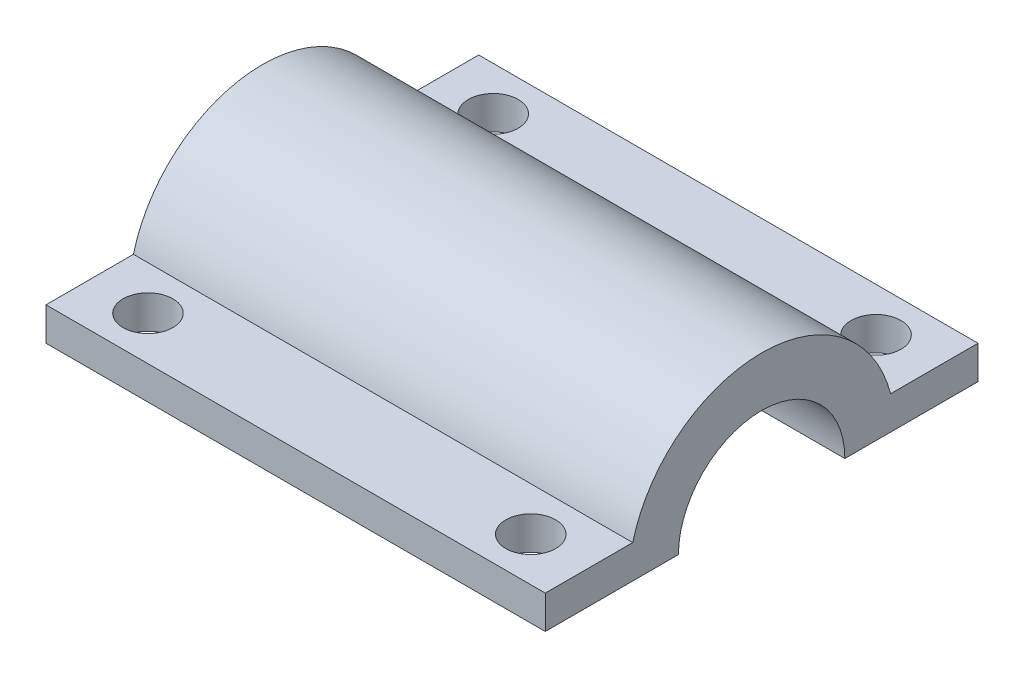
ISO-10303-21;
HEADER;
FILE_DESCRIPTION(('STEP AP214'),'2;1');
FILE_NAME('part.step','',(''),(''),'','','');
FILE_SCHEMA(('AUTOMOTIVE_DESIGN { 1 0 10303 214 1 1 1 1 }'));
ENDSEC;
DATA;
#1=APPLICATION_CONTEXT('core data for automotive mechanical design processes');
#2=APPLICATION_PROTOCOL_DEFINITION('international standard','automotive_design',2000,#1);
#3=PRODUCT_CONTEXT('',#1,'mechanical');
#4=PRODUCT('Part','Part','',(#3));
#5=PRODUCT_RELATED_PRODUCT_CATEGORY('part','',(#4));
#6=PRODUCT_DEFINITION_FORMATION('','',#4);
#7=PRODUCT_DEFINITION_CONTEXT('part definition',#1,'design');
#8=PRODUCT_DEFINITION('design','',#6,#7);
#9=PRODUCT_DEFINITION_SHAPE('','',#8);
#10=(LENGTH_UNIT() NAMED_UNIT(*) SI_UNIT(.MILLI.,.METRE.));
#11=(NAMED_UNIT(*) PLANE_ANGLE_UNIT() SI_UNIT($,.RADIAN.));
#12=(NAMED_UNIT(*) SI_UNIT($,.STERADIAN.) SOLID_ANGLE_UNIT());
#13=UNCERTAINTY_MEASURE_WITH_UNIT(LENGTH_MEASURE(1.E-05),#10,'distance_accuracy_value','');
#14=(GEOMETRIC_REPRESENTATION_CONTEXT(3) GLOBAL_UNCERTAINTY_ASSIGNED_CONTEXT((#13)) GLOBAL_UNIT_ASSIGNED_CONTEXT((#10,
#11,#12)) REPRESENTATION_CONTEXT('',''));
#15=CARTESIAN_POINT('',(0.,0.,0.));
#16=DIRECTION('',(0.,0.,1.));
#17=DIRECTION('',(1.,0.,0.));
#18=AXIS2_PLACEMENT_3D('',#15,#16,#17);
#19=CARTESIAN_POINT('',(30.,0.,0.));
#20=DIRECTION('',(-1.,0.,0.));
#21=DIRECTION('',(0.,0.,1.));
#22=AXIS2_PLACEMENT_3D('',#19,#20,#21);
#23=CYLINDRICAL_SURFACE('',#22,5.);
#24=CARTESIAN_POINT('',(0.,0.,0.));
#25=DIRECTION('',(-1.,0.,0.));
#26=DIRECTION('',(0.,0.,-1.));
#27=AXIS2_PLACEMENT_3D('',#24,#25,#26);
#28=CIRCLE('',#27,5.);
#29=CARTESIAN_POINT('',(0.,0.,5.));
#30=VERTEX_POINT('',#29);
#31=CARTESIAN_POINT('',(0.,0.,-5.));
#32=VERTEX_POINT('',#31);
#33=EDGE_CURVE('E135',#30,#32,#28,.T.);
#34=ORIENTED_EDGE('',*,*,#33,.T.);
#35=DIRECTION('',(-1.,0.,0.));
#36=VECTOR('',#35,1.);
#37=CARTESIAN_POINT('',(30.,0.,-5.));
#38=LINE('',#37,#36);
#39=CARTESIAN_POINT('',(30.,0.,-5.));
#40=VERTEX_POINT('',#39);
#41=EDGE_CURVE('E11',#40,#32,#38,.T.);
#42=ORIENTED_EDGE('',*,*,#41,.F.);
#43=CARTESIAN_POINT('',(30.,0.,0.));
#44=DIRECTION('',(-1.,0.,0.));
#45=DIRECTION('',(0.,0.,-1.));
#46=AXIS2_PLACEMENT_3D('',#43,#44,#45);
#47=CIRCLE('',#46,5.);
#48=CARTESIAN_POINT('',(30.,0.,5.));
#49=VERTEX_POINT('',#48);
#50=EDGE_CURVE('E150',#49,#40,#47,.T.);
#51=ORIENTED_EDGE('',*,*,#50,.F.);
#52=DIRECTION('',(-1.,0.,0.));
#53=VECTOR('',#52,1.);
#54=CARTESIAN_POINT('',(30.,0.,5.));
#55=LINE('',#54,#53);
#56=EDGE_CURVE('E131',#49,#30,#55,.T.);
#57=ORIENTED_EDGE('',*,*,#56,.T.);
#58=EDGE_LOOP('',(#34,#42,#51,#57));
#59=FACE_BOUND('',#58,.T.);
#60=ADVANCED_FACE('F37',(#59),#23,.F.);
#61=CARTESIAN_POINT('',(30.,0.,-5.));
#62=DIRECTION('',(0.,1.,0.));
#63=DIRECTION('',(0.,0.,1.));
#64=AXIS2_PLACEMENT_3D('',#61,#62,#63);
#65=PLANE('',#64);
#66=CARTESIAN_POINT('',(3.50000000000003,0.,-10.3729833462074));
#67=DIRECTION('',(0.,-1.,0.));
#68=DIRECTION('',(0.,0.,-1.));
#69=AXIS2_PLACEMENT_3D('',#66,#67,#68);
#70=CIRCLE('',#69,1.5);
#71=CARTESIAN_POINT('',(3.50000000000003,0.,-11.8729833462074));
#72=VERTEX_POINT('',#71);
#73=EDGE_CURVE('E242',#72,#72,#70,.T.);
#74=ORIENTED_EDGE('',*,*,#73,.F.);
#75=EDGE_LOOP('',(#74));
#76=FACE_BOUND('',#75,.T.);
#77=CARTESIAN_POINT('',(26.5,0.,-10.3729833462074));
#78=DIRECTION('',(0.,-1.,0.));
#79=DIRECTION('',(0.,0.,-1.));
#80=AXIS2_PLACEMENT_3D('',#77,#78,#79);
#81=CIRCLE('',#80,1.5);
#82=CARTESIAN_POINT('',(26.5,0.,-11.8729833462074));
#83=VERTEX_POINT('',#82);
#84=EDGE_CURVE('E162',#83,#83,#81,.T.);
#85=ORIENTED_EDGE('',*,*,#84,.F.);
#86=EDGE_LOOP('',(#85));
#87=FACE_BOUND('',#86,.T.);
#88=DIRECTION('',(0.,0.,-1.));
#89=VECTOR('',#88,1.);
#90=CARTESIAN_POINT('',(0.,0.,-5.));
#91=LINE('',#90,#89);
#92=CARTESIAN_POINT('',(0.,0.,-13.));
#93=VERTEX_POINT('',#92);
#94=EDGE_CURVE('E138',#32,#93,#91,.T.);
#95=ORIENTED_EDGE('',*,*,#94,.T.);
#96=DIRECTION('',(-1.,0.,0.));
#97=VECTOR('',#96,1.);
#98=CARTESIAN_POINT('',(30.,0.,-13.));
#99=LINE('',#98,#97);
#100=CARTESIAN_POINT('',(30.,0.,-13.));
#101=VERTEX_POINT('',#100);
#102=EDGE_CURVE('E46',#101,#93,#99,.T.);
#103=ORIENTED_EDGE('',*,*,#102,.F.);
#104=DIRECTION('',(0.,0.,-1.));
#105=VECTOR('',#104,1.);
#106=CARTESIAN_POINT('',(30.,0.,-5.));
#107=LINE('',#106,#105);
#108=EDGE_CURVE('E98',#40,#101,#107,.T.);
#109=ORIENTED_EDGE('',*,*,#108,.F.);
#110=ORIENTED_EDGE('',*,*,#41,.T.);
#111=EDGE_LOOP('',(#95,#103,#109,#110));
#112=FACE_BOUND('',#111,.T.);
#113=ADVANCED_FACE('F212',(#76,#87,#112),#65,.F.);
#114=CARTESIAN_POINT('',(30.,0.,-13.));
#115=DIRECTION('',(0.,0.,1.));
#116=DIRECTION('',(1.,0.,0.));
#117=AXIS2_PLACEMENT_3D('',#114,#115,#116);
#118=PLANE('',#117);
#119=DIRECTION('',(0.,1.,0.));
#120=VECTOR('',#119,1.);
#121=CARTESIAN_POINT('',(0.,0.,-13.));
#122=LINE('',#121,#120);
#123=CARTESIAN_POINT('',(0.,2.,-13.));
#124=VERTEX_POINT('',#123);
#125=EDGE_CURVE('E141',#93,#124,#122,.T.);
#126=ORIENTED_EDGE('',*,*,#125,.T.);
#127=DIRECTION('',(-1.,0.,0.));
#128=VECTOR('',#127,1.);
#129=CARTESIAN_POINT('',(30.,2.,-13.));
#130=LINE('',#129,#128);
#131=CARTESIAN_POINT('',(30.,2.,-13.));
#132=VERTEX_POINT('',#131);
#133=EDGE_CURVE('E157',#132,#124,#130,.T.);
#134=ORIENTED_EDGE('',*,*,#133,.F.);
#135=DIRECTION('',(0.,1.,0.));
#136=VECTOR('',#135,1.);
#137=CARTESIAN_POINT('',(30.,0.,-13.));
#138=LINE('',#137,#136);
#139=EDGE_CURVE('E176',#101,#132,#138,.T.);
#140=ORIENTED_EDGE('',*,*,#139,.F.);
#141=ORIENTED_EDGE('',*,*,#102,.T.);
#142=EDGE_LOOP('',(#126,#134,#140,#141));
#143=FACE_BOUND('',#142,.T.);
#144=ADVANCED_FACE('F217',(#143),#118,.F.);
#145=CARTESIAN_POINT('',(30.,2.,-13.));
#146=DIRECTION('',(0.,-1.,0.));
#147=DIRECTION('',(0.,0.,-1.));
#148=AXIS2_PLACEMENT_3D('',#145,#146,#147);
#149=PLANE('',#148);
#150=CARTESIAN_POINT('',(3.50000000000003,2.,-10.3729833462074));
#151=DIRECTION('',(0.,-1.,0.));
#152=DIRECTION('',(0.,0.,-1.));
#153=AXIS2_PLACEMENT_3D('',#150,#151,#152);
#154=CIRCLE('',#153,1.5);
#155=CARTESIAN_POINT('',(3.50000000000003,2.,-11.8729833462074));
#156=VERTEX_POINT('',#155);
#157=EDGE_CURVE('E40',#156,#156,#154,.T.);
#158=ORIENTED_EDGE('',*,*,#157,.T.);
#159=EDGE_LOOP('',(#158));
#160=FACE_BOUND('',#159,.T.);
#161=CARTESIAN_POINT('',(26.5,2.,-10.3729833462074));
#162=DIRECTION('',(0.,-1.,0.));
#163=DIRECTION('',(0.,0.,-1.));
#164=AXIS2_PLACEMENT_3D('',#161,#162,#163);
#165=CIRCLE('',#164,1.5);
#166=CARTESIAN_POINT('',(26.5,2.,-11.8729833462074));
#167=VERTEX_POINT('',#166);
#168=EDGE_CURVE('E139',#167,#167,#165,.T.);
#169=ORIENTED_EDGE('',*,*,#168,.T.);
#170=EDGE_LOOP('',(#169));
#171=FACE_BOUND('',#170,.T.);
#172=DIRECTION('',(0.,0.,1.));
#173=VECTOR('',#172,1.);
#174=CARTESIAN_POINT('',(0.,2.,-13.));
#175=LINE('',#174,#173);
#176=CARTESIAN_POINT('',(0.,2.,-7.74596669241483));
#177=VERTEX_POINT('',#176);
#178=EDGE_CURVE('E143',#124,#177,#175,.T.);
#179=ORIENTED_EDGE('',*,*,#178,.T.);
#180=DIRECTION('',(-1.,0.,0.));
#181=VECTOR('',#180,1.);
#182=CARTESIAN_POINT('',(30.,2.,-7.74596669241483));
#183=LINE('',#182,#181);
#184=CARTESIAN_POINT('',(30.,2.,-7.74596669241483));
#185=VERTEX_POINT('',#184);
#186=EDGE_CURVE('E154',#185,#177,#183,.T.);
#187=ORIENTED_EDGE('',*,*,#186,.F.);
#188=DIRECTION('',(0.,0.,1.));
#189=VECTOR('',#188,1.);
#190=CARTESIAN_POINT('',(30.,2.,-13.));
#191=LINE('',#190,#189);
#192=EDGE_CURVE('E178',#132,#185,#191,.T.);
#193=ORIENTED_EDGE('',*,*,#192,.F.);
#194=ORIENTED_EDGE('',*,*,#133,.T.);
#195=EDGE_LOOP('',(#179,#187,#193,#194));
#196=FACE_BOUND('',#195,.T.);
#197=ADVANCED_FACE('F184',(#160,#171,#196),#149,.F.);
#198=CARTESIAN_POINT('',(30.,0.,0.));
#199=DIRECTION('',(-1.,0.,0.));
#200=DIRECTION('',(0.,0.,1.));
#201=AXIS2_PLACEMENT_3D('',#198,#199,#200);
#202=CYLINDRICAL_SURFACE('',#201,8.);
#203=CARTESIAN_POINT('',(0.,0.,0.));
#204=DIRECTION('',(1.,0.,0.));
#205=DIRECTION('',(0.,0.,-1.));
#206=AXIS2_PLACEMENT_3D('',#203,#204,#205);
#207=CIRCLE('',#206,8.);
#208=CARTESIAN_POINT('',(0.,2.,7.74596669241483));
#209=VERTEX_POINT('',#208);
#210=EDGE_CURVE('E145',#177,#209,#207,.T.);
#211=ORIENTED_EDGE('',*,*,#210,.T.);
#212=DIRECTION('',(-1.,0.,0.));
#213=VECTOR('',#212,1.);
#214=CARTESIAN_POINT('',(30.,2.,7.74596669241483));
#215=LINE('',#214,#213);
#216=CARTESIAN_POINT('',(30.,2.,7.74596669241483));
#217=VERTEX_POINT('',#216);
#218=EDGE_CURVE('E126',#217,#209,#215,.T.);
#219=ORIENTED_EDGE('',*,*,#218,.F.);
#220=CARTESIAN_POINT('',(30.,0.,0.));
#221=DIRECTION('',(1.,0.,0.));
#222=DIRECTION('',(0.,0.,-1.));
#223=AXIS2_PLACEMENT_3D('',#220,#221,#222);
#224=CIRCLE('',#223,8.);
#225=EDGE_CURVE('E117',#185,#217,#224,.T.);
#226=ORIENTED_EDGE('',*,*,#225,.F.);
#227=ORIENTED_EDGE('',*,*,#186,.T.);
#228=EDGE_LOOP('',(#211,#219,#226,#227));
#229=FACE_BOUND('',#228,.T.);
#230=ADVANCED_FACE('F188',(#229),#202,.T.);
#231=CARTESIAN_POINT('',(30.,2.,13.));
#232=DIRECTION('',(0.,-1.,0.));
#233=DIRECTION('',(0.,0.,-1.));
#234=AXIS2_PLACEMENT_3D('',#231,#232,#233);
#235=PLANE('',#234);
#236=CARTESIAN_POINT('',(3.50000000000003,2.,10.3729833462074));
#237=DIRECTION('',(0.,-1.,0.));
#238=DIRECTION('',(0.,0.,-1.));
#239=AXIS2_PLACEMENT_3D('',#236,#237,#238);
#240=CIRCLE('',#239,1.5);
#241=CARTESIAN_POINT('',(3.50000000000003,2.,8.87298334620744));
#242=VERTEX_POINT('',#241);
#243=EDGE_CURVE('E170',#242,#242,#240,.T.);
#244=ORIENTED_EDGE('',*,*,#243,.T.);
#245=EDGE_LOOP('',(#244));
#246=FACE_BOUND('',#245,.T.);
#247=CARTESIAN_POINT('',(26.5,2.,10.3729833462074));
#248=DIRECTION('',(0.,-1.,0.));
#249=DIRECTION('',(0.,0.,-1.));
#250=AXIS2_PLACEMENT_3D('',#247,#248,#249);
#251=CIRCLE('',#250,1.5);
#252=CARTESIAN_POINT('',(26.5,2.,8.87298334620744));
#253=VERTEX_POINT('',#252);
#254=EDGE_CURVE('E240',#253,#253,#251,.T.);
#255=ORIENTED_EDGE('',*,*,#254,.T.);
#256=EDGE_LOOP('',(#255));
#257=FACE_BOUND('',#256,.T.);
#258=DIRECTION('',(0.,0.,1.));
#259=VECTOR('',#258,1.);
#260=CARTESIAN_POINT('',(0.,2.,13.));
#261=LINE('',#260,#259);
#262=CARTESIAN_POINT('',(0.,2.,13.));
#263=VERTEX_POINT('',#262);
#264=EDGE_CURVE('E125',#209,#263,#261,.T.);
#265=ORIENTED_EDGE('',*,*,#264,.T.);
#266=DIRECTION('',(-1.,0.,0.));
#267=VECTOR('',#266,1.);
#268=CARTESIAN_POINT('',(30.,2.,13.));
#269=LINE('',#268,#267);
#270=CARTESIAN_POINT('',(30.,2.,13.));
#271=VERTEX_POINT('',#270);
#272=EDGE_CURVE('E122',#271,#263,#269,.T.);
#273=ORIENTED_EDGE('',*,*,#272,.F.);
#274=DIRECTION('',(0.,0.,1.));
#275=VECTOR('',#274,1.);
#276=CARTESIAN_POINT('',(30.,2.,13.));
#277=LINE('',#276,#275);
#278=EDGE_CURVE('E111',#217,#271,#277,.T.);
#279=ORIENTED_EDGE('',*,*,#278,.F.);
#280=ORIENTED_EDGE('',*,*,#218,.T.);
#281=EDGE_LOOP('',(#265,#273,#279,#280));
#282=FACE_BOUND('',#281,.T.);
#283=ADVANCED_FACE('F123',(#246,#257,#282),#235,.F.);
#284=CARTESIAN_POINT('',(30.,0.,13.));
#285=DIRECTION('',(0.,0.,-1.));
#286=DIRECTION('',(-1.,0.,0.));
#287=AXIS2_PLACEMENT_3D('',#284,#285,#286);
#288=PLANE('',#287);
#289=DIRECTION('',(0.,-1.,0.));
#290=VECTOR('',#289,1.);
#291=CARTESIAN_POINT('',(0.,0.,13.));
#292=LINE('',#291,#290);
#293=CARTESIAN_POINT('',(0.,0.,13.));
#294=VERTEX_POINT('',#293);
#295=EDGE_CURVE('E84',#263,#294,#292,.T.);
#296=ORIENTED_EDGE('',*,*,#295,.T.);
#297=DIRECTION('',(-1.,0.,0.));
#298=VECTOR('',#297,1.);
#299=CARTESIAN_POINT('',(30.,0.,13.));
#300=LINE('',#299,#298);
#301=CARTESIAN_POINT('',(30.,0.,13.));
#302=VERTEX_POINT('',#301);
#303=EDGE_CURVE('E127',#302,#294,#300,.T.);
#304=ORIENTED_EDGE('',*,*,#303,.F.);
#305=DIRECTION('',(0.,-1.,0.));
#306=VECTOR('',#305,1.);
#307=CARTESIAN_POINT('',(30.,0.,13.));
#308=LINE('',#307,#306);
#309=EDGE_CURVE('E115',#271,#302,#308,.T.);
#310=ORIENTED_EDGE('',*,*,#309,.F.);
#311=ORIENTED_EDGE('',*,*,#272,.T.);
#312=EDGE_LOOP('',(#296,#304,#310,#311));
#313=FACE_BOUND('',#312,.T.);
#314=ADVANCED_FACE('F129',(#313),#288,.F.);
#315=CARTESIAN_POINT('',(30.,0.,5.));
#316=DIRECTION('',(0.,1.,0.));
#317=DIRECTION('',(0.,0.,1.));
#318=AXIS2_PLACEMENT_3D('',#315,#316,#317);
#319=PLANE('',#318);
#320=CARTESIAN_POINT('',(3.50000000000003,0.,10.3729833462074));
#321=DIRECTION('',(0.,-1.,0.));
#322=DIRECTION('',(0.,0.,-1.));
#323=AXIS2_PLACEMENT_3D('',#320,#321,#322);
#324=CIRCLE('',#323,1.5);
#325=CARTESIAN_POINT('',(3.50000000000003,0.,8.87298334620744));
#326=VERTEX_POINT('',#325);
#327=EDGE_CURVE('E244',#326,#326,#324,.T.);
#328=ORIENTED_EDGE('',*,*,#327,.F.);
#329=EDGE_LOOP('',(#328));
#330=FACE_BOUND('',#329,.T.);
#331=CARTESIAN_POINT('',(26.5,0.,10.3729833462074));
#332=DIRECTION('',(0.,-1.,0.));
#333=DIRECTION('',(0.,0.,-1.));
#334=AXIS2_PLACEMENT_3D('',#331,#332,#333);
#335=CIRCLE('',#334,1.5);
#336=CARTESIAN_POINT('',(26.5,0.,8.87298334620744));
#337=VERTEX_POINT('',#336);
#338=EDGE_CURVE('E247',#337,#337,#335,.T.);
#339=ORIENTED_EDGE('',*,*,#338,.F.);
#340=EDGE_LOOP('',(#339));
#341=FACE_BOUND('',#340,.T.);
#342=DIRECTION('',(0.,0.,-1.));
#343=VECTOR('',#342,1.);
#344=CARTESIAN_POINT('',(0.,0.,5.));
#345=LINE('',#344,#343);
#346=EDGE_CURVE('E90',#294,#30,#345,.T.);
#347=ORIENTED_EDGE('',*,*,#346,.T.);
#348=ORIENTED_EDGE('',*,*,#56,.F.);
#349=DIRECTION('',(0.,0.,-1.));
#350=VECTOR('',#349,1.);
#351=CARTESIAN_POINT('',(30.,0.,5.));
#352=LINE('',#351,#350);
#353=EDGE_CURVE('E55',#302,#49,#352,.T.);
#354=ORIENTED_EDGE('',*,*,#353,.F.);
#355=ORIENTED_EDGE('',*,*,#303,.T.);
#356=EDGE_LOOP('',(#347,#348,#354,#355));
#357=FACE_BOUND('',#356,.T.);
#358=ADVANCED_FACE('F196',(#330,#341,#357),#319,.F.);
#359=CARTESIAN_POINT('',(30.,0.,0.));
#360=DIRECTION('',(1.,0.,0.));
#361=DIRECTION('',(0.,0.,-1.));
#362=AXIS2_PLACEMENT_3D('',#359,#360,#361);
#363=PLANE('',#362);
#364=ORIENTED_EDGE('',*,*,#50,.T.);
#365=ORIENTED_EDGE('',*,*,#108,.T.);
#366=ORIENTED_EDGE('',*,*,#139,.T.);
#367=ORIENTED_EDGE('',*,*,#192,.T.);
#368=ORIENTED_EDGE('',*,*,#225,.T.);
#369=ORIENTED_EDGE('',*,*,#278,.T.);
#370=ORIENTED_EDGE('',*,*,#309,.T.);
#371=ORIENTED_EDGE('',*,*,#353,.T.);
#372=EDGE_LOOP('',(#364,#365,#366,#367,#368,#369,#370,#371));
#373=FACE_BOUND('',#372,.T.);
#374=ADVANCED_FACE('F113',(#373),#363,.T.);
#375=CARTESIAN_POINT('',(0.,0.,0.));
#376=DIRECTION('',(1.,0.,0.));
#377=DIRECTION('',(0.,0.,-1.));
#378=AXIS2_PLACEMENT_3D('',#375,#376,#377);
#379=PLANE('',#378);
#380=ORIENTED_EDGE('',*,*,#33,.F.);
#381=ORIENTED_EDGE('',*,*,#346,.F.);
#382=ORIENTED_EDGE('',*,*,#295,.F.);
#383=ORIENTED_EDGE('',*,*,#264,.F.);
#384=ORIENTED_EDGE('',*,*,#210,.F.);
#385=ORIENTED_EDGE('',*,*,#178,.F.);
#386=ORIENTED_EDGE('',*,*,#125,.F.);
#387=ORIENTED_EDGE('',*,*,#94,.F.);
#388=EDGE_LOOP('',(#380,#381,#382,#383,#384,#385,#386,#387));
#389=FACE_BOUND('',#388,.T.);
#390=ADVANCED_FACE('F191',(#389),#379,.F.);
#391=CARTESIAN_POINT('',(26.5,10.,-10.3729833462074));
#392=DIRECTION('',(0.,-1.,0.));
#393=DIRECTION('',(0.,0.,-1.));
#394=AXIS2_PLACEMENT_3D('',#391,#392,#393);
#395=CYLINDRICAL_SURFACE('',#394,1.5);
#396=ORIENTED_EDGE('',*,*,#84,.T.);
#397=EDGE_LOOP('',(#396));
#398=FACE_BOUND('',#397,.T.);
#399=ORIENTED_EDGE('',*,*,#168,.F.);
#400=EDGE_LOOP('',(#399));
#401=FACE_BOUND('',#400,.T.);
#402=ADVANCED_FACE('F264',(#398,#401),#395,.F.);
#403=CARTESIAN_POINT('',(26.5,10.,10.3729833462074));
#404=DIRECTION('',(0.,-1.,0.));
#405=DIRECTION('',(0.,0.,-1.));
#406=AXIS2_PLACEMENT_3D('',#403,#404,#405);
#407=CYLINDRICAL_SURFACE('',#406,1.5);
#408=ORIENTED_EDGE('',*,*,#338,.T.);
#409=EDGE_LOOP('',(#408));
#410=FACE_BOUND('',#409,.T.);
#411=ORIENTED_EDGE('',*,*,#254,.F.);
#412=EDGE_LOOP('',(#411));
#413=FACE_BOUND('',#412,.T.);
#414=ADVANCED_FACE('F256',(#410,#413),#407,.F.);
#415=CARTESIAN_POINT('',(3.50000000000003,10.,10.3729833462074));
#416=DIRECTION('',(0.,-1.,0.));
#417=DIRECTION('',(0.,0.,-1.));
#418=AXIS2_PLACEMENT_3D('',#415,#416,#417);
#419=CYLINDRICAL_SURFACE('',#418,1.5);
#420=ORIENTED_EDGE('',*,*,#327,.T.);
#421=EDGE_LOOP('',(#420));
#422=FACE_BOUND('',#421,.T.);
#423=ORIENTED_EDGE('',*,*,#243,.F.);
#424=EDGE_LOOP('',(#423));
#425=FACE_BOUND('',#424,.T.);
#426=ADVANCED_FACE('F252',(#422,#425),#419,.F.);
#427=CARTESIAN_POINT('',(3.50000000000003,10.,-10.3729833462074));
#428=DIRECTION('',(0.,-1.,0.));
#429=DIRECTION('',(0.,0.,-1.));
#430=AXIS2_PLACEMENT_3D('',#427,#428,#429);
#431=CYLINDRICAL_SURFACE('',#430,1.5);
#432=ORIENTED_EDGE('',*,*,#73,.T.);
#433=EDGE_LOOP('',(#432));
#434=FACE_BOUND('',#433,.T.);
#435=ORIENTED_EDGE('',*,*,#157,.F.);
#436=EDGE_LOOP('',(#435));
#437=FACE_BOUND('',#436,.T.);
#438=ADVANCED_FACE('F255',(#434,#437),#431,.F.);
#439=CLOSED_SHELL('',(#60,#113,#144,#197,#230,#283,#314,#358,#374,#390,#402,#414,#426,#438));
#440=MANIFOLD_SOLID_BREP('B2',#439);
#441=ADVANCED_BREP_SHAPE_REPRESENTATION('',(#18,#440),#14);
#442=SHAPE_DEFINITION_REPRESENTATION(#9,#441);
ENDSEC;
END-ISO-10303-21;
